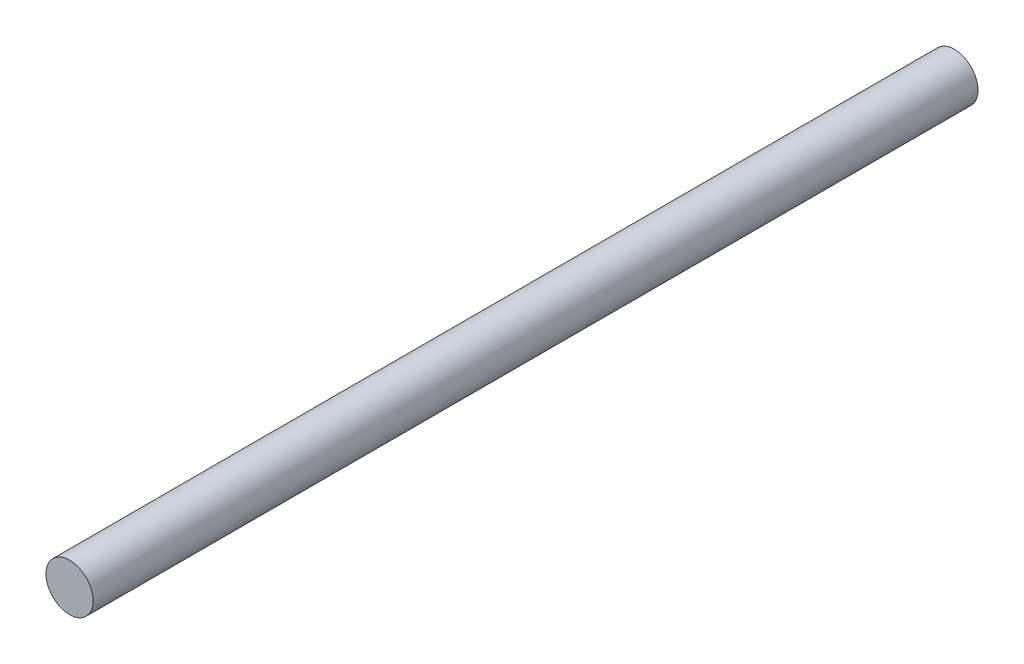
ISO-10303-21;
HEADER;
FILE_DESCRIPTION(('STEP AP214'),'2;1');
FILE_NAME('part.step','',(''),(''),'','','');
FILE_SCHEMA(('AUTOMOTIVE_DESIGN { 1 0 10303 214 1 1 1 1 }'));
ENDSEC;
DATA;
#1=APPLICATION_CONTEXT('core data for automotive mechanical design processes');
#2=APPLICATION_PROTOCOL_DEFINITION('international standard','automotive_design',2000,#1);
#3=PRODUCT_CONTEXT('',#1,'mechanical');
#4=PRODUCT('Part','Part','',(#3));
#5=PRODUCT_RELATED_PRODUCT_CATEGORY('part','',(#4));
#6=PRODUCT_DEFINITION_FORMATION('','',#4);
#7=PRODUCT_DEFINITION_CONTEXT('part definition',#1,'design');
#8=PRODUCT_DEFINITION('design','',#6,#7);
#9=PRODUCT_DEFINITION_SHAPE('','',#8);
#10=(LENGTH_UNIT() NAMED_UNIT(*) SI_UNIT(.MILLI.,.METRE.));
#11=(NAMED_UNIT(*) PLANE_ANGLE_UNIT() SI_UNIT($,.RADIAN.));
#12=(NAMED_UNIT(*) SI_UNIT($,.STERADIAN.) SOLID_ANGLE_UNIT());
#13=UNCERTAINTY_MEASURE_WITH_UNIT(LENGTH_MEASURE(1.E-05),#10,'distance_accuracy_value','');
#14=(GEOMETRIC_REPRESENTATION_CONTEXT(3) GLOBAL_UNCERTAINTY_ASSIGNED_CONTEXT((#13)) GLOBAL_UNIT_ASSIGNED_CONTEXT((#10,
#11,#12)) REPRESENTATION_CONTEXT('',''));
#15=CARTESIAN_POINT('',(0.,0.,0.));
#16=DIRECTION('',(0.,0.,1.));
#17=DIRECTION('',(1.,0.,0.));
#18=AXIS2_PLACEMENT_3D('',#15,#16,#17);
#19=CARTESIAN_POINT('',(0.,0.,150.));
#20=DIRECTION('',(0.,0.,-1.));
#21=DIRECTION('',(-1.,0.,0.));
#22=AXIS2_PLACEMENT_3D('',#19,#20,#21);
#23=CYLINDRICAL_SURFACE('',#22,4.);
#24=CARTESIAN_POINT('',(0.,0.,150.));
#25=DIRECTION('',(0.,0.,1.));
#26=DIRECTION('',(1.,0.,0.));
#27=AXIS2_PLACEMENT_3D('',#24,#25,#26);
#28=CIRCLE('',#27,4.);
#29=CARTESIAN_POINT('',(4.,0.,150.));
#30=VERTEX_POINT('',#29);
#31=EDGE_CURVE('E12',#30,#30,#28,.T.);
#32=ORIENTED_EDGE('',*,*,#31,.F.);
#33=EDGE_LOOP('',(#32));
#34=FACE_BOUND('',#33,.T.);
#35=CARTESIAN_POINT('',(0.,0.,0.));
#36=DIRECTION('',(0.,0.,1.));
#37=DIRECTION('',(1.,0.,0.));
#38=AXIS2_PLACEMENT_3D('',#35,#36,#37);
#39=CIRCLE('',#38,4.);
#40=CARTESIAN_POINT('',(4.,0.,0.));
#41=VERTEX_POINT('',#40);
#42=EDGE_CURVE('E49',#41,#41,#39,.T.);
#43=ORIENTED_EDGE('',*,*,#42,.T.);
#44=EDGE_LOOP('',(#43));
#45=FACE_BOUND('',#44,.T.);
#46=ADVANCED_FACE('F46',(#34,#45),#23,.T.);
#47=CARTESIAN_POINT('',(0.,0.,150.));
#48=DIRECTION('',(0.,0.,1.));
#49=DIRECTION('',(1.,0.,0.));
#50=AXIS2_PLACEMENT_3D('',#47,#48,#49);
#51=PLANE('',#50);
#52=ORIENTED_EDGE('',*,*,#31,.T.);
#53=EDGE_LOOP('',(#52));
#54=FACE_BOUND('',#53,.T.);
#55=ADVANCED_FACE('F64',(#54),#51,.T.);
#56=CARTESIAN_POINT('',(0.,0.,0.));
#57=DIRECTION('',(0.,0.,1.));
#58=DIRECTION('',(1.,0.,0.));
#59=AXIS2_PLACEMENT_3D('',#56,#57,#58);
#60=PLANE('',#59);
#61=ORIENTED_EDGE('',*,*,#42,.F.);
#62=EDGE_LOOP('',(#61));
#63=FACE_BOUND('',#62,.T.);
#64=ADVANCED_FACE('F62',(#63),#60,.F.);
#65=CLOSED_SHELL('',(#46,#55,#64));
#66=MANIFOLD_SOLID_BREP('B2',#65);
#67=ADVANCED_BREP_SHAPE_REPRESENTATION('',(#18,#66),#14);
#68=SHAPE_DEFINITION_REPRESENTATION(#9,#67);
ENDSEC;
END-ISO-10303-21;
